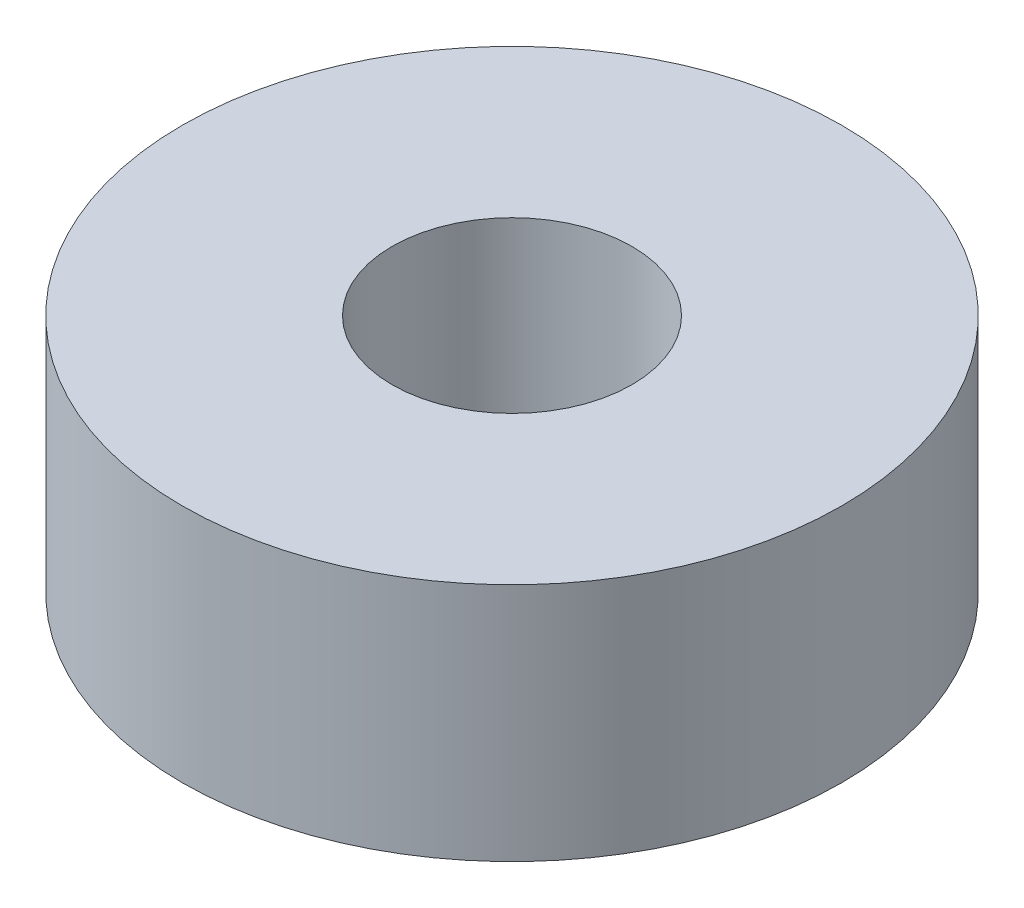
ISO-10303-21;
HEADER;
FILE_DESCRIPTION(('STEP AP214'),'2;1');
FILE_NAME('part.step','',(''),(''),'','','');
FILE_SCHEMA(('AUTOMOTIVE_DESIGN { 1 0 10303 214 1 1 1 1 }'));
ENDSEC;
DATA;
#1=APPLICATION_CONTEXT('core data for automotive mechanical design processes');
#2=APPLICATION_PROTOCOL_DEFINITION('international standard','automotive_design',2000,#1);
#3=PRODUCT_CONTEXT('',#1,'mechanical');
#4=PRODUCT('Part','Part','',(#3));
#5=PRODUCT_RELATED_PRODUCT_CATEGORY('part','',(#4));
#6=PRODUCT_DEFINITION_FORMATION('','',#4);
#7=PRODUCT_DEFINITION_CONTEXT('part definition',#1,'design');
#8=PRODUCT_DEFINITION('design','',#6,#7);
#9=PRODUCT_DEFINITION_SHAPE('','',#8);
#10=(LENGTH_UNIT() NAMED_UNIT(*) SI_UNIT(.MILLI.,.METRE.));
#11=(NAMED_UNIT(*) PLANE_ANGLE_UNIT() SI_UNIT($,.RADIAN.));
#12=(NAMED_UNIT(*) SI_UNIT($,.STERADIAN.) SOLID_ANGLE_UNIT());
#13=UNCERTAINTY_MEASURE_WITH_UNIT(LENGTH_MEASURE(1.E-05),#10,'distance_accuracy_value','');
#14=(GEOMETRIC_REPRESENTATION_CONTEXT(3) GLOBAL_UNCERTAINTY_ASSIGNED_CONTEXT((#13)) GLOBAL_UNIT_ASSIGNED_CONTEXT((#10,
#11,#12)) REPRESENTATION_CONTEXT('',''));
#15=CARTESIAN_POINT('',(0.,0.,0.));
#16=DIRECTION('',(0.,0.,1.));
#17=DIRECTION('',(1.,0.,0.));
#18=AXIS2_PLACEMENT_3D('',#15,#16,#17);
#19=CARTESIAN_POINT('',(0.,4.,0.));
#20=DIRECTION('',(0.,1.,0.));
#21=DIRECTION('',(0.,0.,1.));
#22=AXIS2_PLACEMENT_3D('',#19,#20,#21);
#23=PLANE('',#22);
#24=CARTESIAN_POINT('',(0.,4.,0.));
#25=DIRECTION('',(0.,1.,0.));
#26=DIRECTION('',(0.,0.,1.));
#27=AXIS2_PLACEMENT_3D('',#24,#25,#26);
#28=CIRCLE('',#27,5.5);
#29=CARTESIAN_POINT('',(0.,4.,5.5));
#30=VERTEX_POINT('',#29);
#31=EDGE_CURVE('E10',#30,#30,#28,.T.);
#32=ORIENTED_EDGE('',*,*,#31,.T.);
#33=EDGE_LOOP('',(#32));
#34=FACE_BOUND('',#33,.T.);
#35=CARTESIAN_POINT('',(0.,4.,0.));
#36=DIRECTION('',(0.,1.,0.));
#37=DIRECTION('',(0.,0.,1.));
#38=AXIS2_PLACEMENT_3D('',#35,#36,#37);
#39=CIRCLE('',#38,2.);
#40=CARTESIAN_POINT('',(0.,4.,2.));
#41=VERTEX_POINT('',#40);
#42=EDGE_CURVE('E40',#41,#41,#39,.T.);
#43=ORIENTED_EDGE('',*,*,#42,.F.);
#44=EDGE_LOOP('',(#43));
#45=FACE_BOUND('',#44,.T.);
#46=ADVANCED_FACE('F29',(#34,#45),#23,.T.);
#47=CARTESIAN_POINT('',(0.,0.,0.));
#48=DIRECTION('',(0.,1.,0.));
#49=DIRECTION('',(0.,0.,1.));
#50=AXIS2_PLACEMENT_3D('',#47,#48,#49);
#51=PLANE('',#50);
#52=CARTESIAN_POINT('',(0.,0.,0.));
#53=DIRECTION('',(0.,1.,0.));
#54=DIRECTION('',(0.,0.,1.));
#55=AXIS2_PLACEMENT_3D('',#52,#53,#54);
#56=CIRCLE('',#55,5.5);
#57=CARTESIAN_POINT('',(0.,0.,5.5));
#58=VERTEX_POINT('',#57);
#59=EDGE_CURVE('E33',#58,#58,#56,.T.);
#60=ORIENTED_EDGE('',*,*,#59,.F.);
#61=EDGE_LOOP('',(#60));
#62=FACE_BOUND('',#61,.T.);
#63=CARTESIAN_POINT('',(0.,0.,0.));
#64=DIRECTION('',(0.,1.,0.));
#65=DIRECTION('',(0.,0.,1.));
#66=AXIS2_PLACEMENT_3D('',#63,#64,#65);
#67=CIRCLE('',#66,2.);
#68=CARTESIAN_POINT('',(0.,0.,2.));
#69=VERTEX_POINT('',#68);
#70=EDGE_CURVE('E42',#69,#69,#67,.T.);
#71=ORIENTED_EDGE('',*,*,#70,.T.);
#72=EDGE_LOOP('',(#71));
#73=FACE_BOUND('',#72,.T.);
#74=ADVANCED_FACE('F52',(#62,#73),#51,.F.);
#75=CARTESIAN_POINT('',(0.,4.,0.));
#76=DIRECTION('',(0.,-1.,0.));
#77=DIRECTION('',(0.,0.,-1.));
#78=AXIS2_PLACEMENT_3D('',#75,#76,#77);
#79=CYLINDRICAL_SURFACE('',#78,5.5);
#80=ORIENTED_EDGE('',*,*,#31,.F.);
#81=EDGE_LOOP('',(#80));
#82=FACE_BOUND('',#81,.T.);
#83=ORIENTED_EDGE('',*,*,#59,.T.);
#84=EDGE_LOOP('',(#83));
#85=FACE_BOUND('',#84,.T.);
#86=ADVANCED_FACE('F31',(#82,#85),#79,.T.);
#87=CARTESIAN_POINT('',(0.,4.,0.));
#88=DIRECTION('',(0.,-1.,0.));
#89=DIRECTION('',(0.,0.,-1.));
#90=AXIS2_PLACEMENT_3D('',#87,#88,#89);
#91=CYLINDRICAL_SURFACE('',#90,2.);
#92=ORIENTED_EDGE('',*,*,#42,.T.);
#93=EDGE_LOOP('',(#92));
#94=FACE_BOUND('',#93,.T.);
#95=ORIENTED_EDGE('',*,*,#70,.F.);
#96=EDGE_LOOP('',(#95));
#97=FACE_BOUND('',#96,.T.);
#98=ADVANCED_FACE('F48',(#94,#97),#91,.F.);
#99=CLOSED_SHELL('',(#46,#74,#86,#98));
#100=MANIFOLD_SOLID_BREP('B2',#99);
#101=ADVANCED_BREP_SHAPE_REPRESENTATION('',(#18,#100),#14);
#102=SHAPE_DEFINITION_REPRESENTATION(#9,#101);
ENDSEC;
END-ISO-10303-21;
